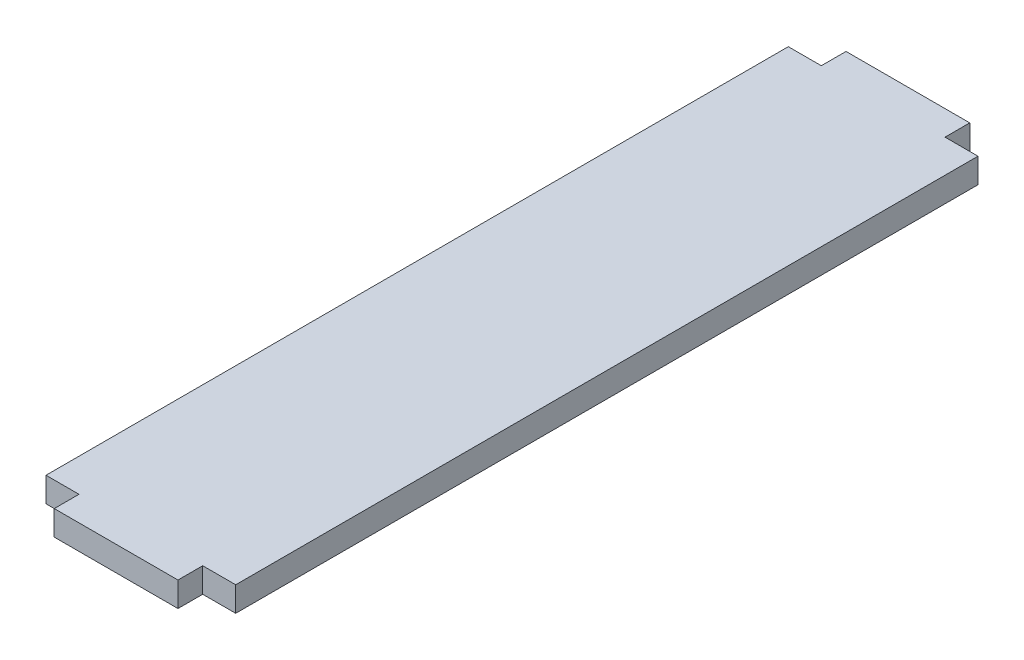
ISO-10303-21;
HEADER;
FILE_DESCRIPTION(('STEP AP214'),'2;1');
FILE_NAME('part.step','',(''),(''),'','','');
FILE_SCHEMA(('AUTOMOTIVE_DESIGN { 1 0 10303 214 1 1 1 1 }'));
ENDSEC;
DATA;
#1=APPLICATION_CONTEXT('core data for automotive mechanical design processes');
#2=APPLICATION_PROTOCOL_DEFINITION('international standard','automotive_design',2000,#1);
#3=PRODUCT_CONTEXT('',#1,'mechanical');
#4=PRODUCT('Part','Part','',(#3));
#5=PRODUCT_RELATED_PRODUCT_CATEGORY('part','',(#4));
#6=PRODUCT_DEFINITION_FORMATION('','',#4);
#7=PRODUCT_DEFINITION_CONTEXT('part definition',#1,'design');
#8=PRODUCT_DEFINITION('design','',#6,#7);
#9=PRODUCT_DEFINITION_SHAPE('','',#8);
#10=(LENGTH_UNIT() NAMED_UNIT(*) SI_UNIT(.MILLI.,.METRE.));
#11=(NAMED_UNIT(*) PLANE_ANGLE_UNIT() SI_UNIT($,.RADIAN.));
#12=(NAMED_UNIT(*) SI_UNIT($,.STERADIAN.) SOLID_ANGLE_UNIT());
#13=UNCERTAINTY_MEASURE_WITH_UNIT(LENGTH_MEASURE(1.E-05),#10,'distance_accuracy_value','');
#14=(GEOMETRIC_REPRESENTATION_CONTEXT(3) GLOBAL_UNCERTAINTY_ASSIGNED_CONTEXT((#13)) GLOBAL_UNIT_ASSIGNED_CONTEXT((#10,
#11,#12)) REPRESENTATION_CONTEXT('',''));
#15=CARTESIAN_POINT('',(0.,0.,0.));
#16=DIRECTION('',(0.,0.,1.));
#17=DIRECTION('',(1.,0.,0.));
#18=AXIS2_PLACEMENT_3D('',#15,#16,#17);
#19=CARTESIAN_POINT('',(5.75,1.5,22.5));
#20=DIRECTION('',(-1.,0.,0.));
#21=DIRECTION('',(0.,0.,1.));
#22=AXIS2_PLACEMENT_3D('',#19,#20,#21);
#23=PLANE('',#22);
#24=DIRECTION('',(0.,0.,-1.));
#25=VECTOR('',#24,1.);
#26=CARTESIAN_POINT('',(5.75,0.,22.5));
#27=LINE('',#26,#25);
#28=CARTESIAN_POINT('',(5.75,0.,22.5));
#29=VERTEX_POINT('',#28);
#30=CARTESIAN_POINT('',(5.75,0.,-22.5));
#31=VERTEX_POINT('',#30);
#32=EDGE_CURVE('E152',#29,#31,#27,.T.);
#33=ORIENTED_EDGE('',*,*,#32,.T.);
#34=DIRECTION('',(0.,-1.,0.));
#35=VECTOR('',#34,1.);
#36=CARTESIAN_POINT('',(5.75,1.5,-22.5));
#37=LINE('',#36,#35);
#38=CARTESIAN_POINT('',(5.75,1.5,-22.5));
#39=VERTEX_POINT('',#38);
#40=EDGE_CURVE('E11',#39,#31,#37,.T.);
#41=ORIENTED_EDGE('',*,*,#40,.F.);
#42=DIRECTION('',(0.,0.,-1.));
#43=VECTOR('',#42,1.);
#44=CARTESIAN_POINT('',(5.75,1.5,22.5));
#45=LINE('',#44,#43);
#46=CARTESIAN_POINT('',(5.75,1.5,22.5));
#47=VERTEX_POINT('',#46);
#48=EDGE_CURVE('E174',#47,#39,#45,.T.);
#49=ORIENTED_EDGE('',*,*,#48,.F.);
#50=DIRECTION('',(0.,-1.,0.));
#51=VECTOR('',#50,1.);
#52=CARTESIAN_POINT('',(5.75,1.5,22.5));
#53=LINE('',#52,#51);
#54=EDGE_CURVE('E148',#47,#29,#53,.T.);
#55=ORIENTED_EDGE('',*,*,#54,.T.);
#56=EDGE_LOOP('',(#33,#41,#49,#55));
#57=FACE_BOUND('',#56,.T.);
#58=ADVANCED_FACE('F32',(#57),#23,.F.);
#59=CARTESIAN_POINT('',(3.75,1.5,-22.5));
#60=DIRECTION('',(0.,0.,1.));
#61=DIRECTION('',(1.,0.,0.));
#62=AXIS2_PLACEMENT_3D('',#59,#60,#61);
#63=PLANE('',#62);
#64=DIRECTION('',(-1.,0.,0.));
#65=VECTOR('',#64,1.);
#66=CARTESIAN_POINT('',(3.75,0.,-22.5));
#67=LINE('',#66,#65);
#68=CARTESIAN_POINT('',(3.75,0.,-22.5));
#69=VERTEX_POINT('',#68);
#70=EDGE_CURVE('E155',#31,#69,#67,.T.);
#71=ORIENTED_EDGE('',*,*,#70,.T.);
#72=DIRECTION('',(0.,-1.,0.));
#73=VECTOR('',#72,1.);
#74=CARTESIAN_POINT('',(3.75,1.5,-22.5));
#75=LINE('',#74,#73);
#76=CARTESIAN_POINT('',(3.75,1.5,-22.5));
#77=VERTEX_POINT('',#76);
#78=EDGE_CURVE('E40',#77,#69,#75,.T.);
#79=ORIENTED_EDGE('',*,*,#78,.F.);
#80=DIRECTION('',(-1.,0.,0.));
#81=VECTOR('',#80,1.);
#82=CARTESIAN_POINT('',(3.75,1.5,-22.5));
#83=LINE('',#82,#81);
#84=EDGE_CURVE('E103',#39,#77,#83,.T.);
#85=ORIENTED_EDGE('',*,*,#84,.F.);
#86=ORIENTED_EDGE('',*,*,#40,.T.);
#87=EDGE_LOOP('',(#71,#79,#85,#86));
#88=FACE_BOUND('',#87,.T.);
#89=ADVANCED_FACE('F252',(#88),#63,.F.);
#90=CARTESIAN_POINT('',(3.75,1.5,-22.5));
#91=DIRECTION('',(-1.,0.,0.));
#92=DIRECTION('',(0.,0.,1.));
#93=AXIS2_PLACEMENT_3D('',#90,#91,#92);
#94=PLANE('',#93);
#95=DIRECTION('',(0.,0.,-1.));
#96=VECTOR('',#95,1.);
#97=CARTESIAN_POINT('',(3.75,0.,-22.5));
#98=LINE('',#97,#96);
#99=CARTESIAN_POINT('',(3.75,0.,-24.));
#100=VERTEX_POINT('',#99);
#101=EDGE_CURVE('E157',#69,#100,#98,.T.);
#102=ORIENTED_EDGE('',*,*,#101,.T.);
#103=DIRECTION('',(0.,-1.,0.));
#104=VECTOR('',#103,1.);
#105=CARTESIAN_POINT('',(3.75,1.5,-24.));
#106=LINE('',#105,#104);
#107=CARTESIAN_POINT('',(3.75,1.5,-24.));
#108=VERTEX_POINT('',#107);
#109=EDGE_CURVE('E193',#108,#100,#106,.T.);
#110=ORIENTED_EDGE('',*,*,#109,.F.);
#111=DIRECTION('',(0.,0.,-1.));
#112=VECTOR('',#111,1.);
#113=CARTESIAN_POINT('',(3.75,1.5,-22.5));
#114=LINE('',#113,#112);
#115=EDGE_CURVE('E201',#77,#108,#114,.T.);
#116=ORIENTED_EDGE('',*,*,#115,.F.);
#117=ORIENTED_EDGE('',*,*,#78,.T.);
#118=EDGE_LOOP('',(#102,#110,#116,#117));
#119=FACE_BOUND('',#118,.T.);
#120=ADVANCED_FACE('F199',(#119),#94,.F.);
#121=CARTESIAN_POINT('',(-3.75,1.5,-24.));
#122=DIRECTION('',(0.,0.,1.));
#123=DIRECTION('',(1.,0.,0.));
#124=AXIS2_PLACEMENT_3D('',#121,#122,#123);
#125=PLANE('',#124);
#126=DIRECTION('',(-1.,0.,0.));
#127=VECTOR('',#126,1.);
#128=CARTESIAN_POINT('',(-3.75,0.,-24.));
#129=LINE('',#128,#127);
#130=CARTESIAN_POINT('',(-3.75,0.,-24.));
#131=VERTEX_POINT('',#130);
#132=EDGE_CURVE('E159',#100,#131,#129,.T.);
#133=ORIENTED_EDGE('',*,*,#132,.T.);
#134=DIRECTION('',(0.,-1.,0.));
#135=VECTOR('',#134,1.);
#136=CARTESIAN_POINT('',(-3.75,1.5,-24.));
#137=LINE('',#136,#135);
#138=CARTESIAN_POINT('',(-3.75,1.5,-24.));
#139=VERTEX_POINT('',#138);
#140=EDGE_CURVE('E190',#139,#131,#137,.T.);
#141=ORIENTED_EDGE('',*,*,#140,.F.);
#142=DIRECTION('',(-1.,0.,0.));
#143=VECTOR('',#142,1.);
#144=CARTESIAN_POINT('',(-3.75,1.5,-24.));
#145=LINE('',#144,#143);
#146=EDGE_CURVE('E219',#108,#139,#145,.T.);
#147=ORIENTED_EDGE('',*,*,#146,.F.);
#148=ORIENTED_EDGE('',*,*,#109,.T.);
#149=EDGE_LOOP('',(#133,#141,#147,#148));
#150=FACE_BOUND('',#149,.T.);
#151=ADVANCED_FACE('F210',(#150),#125,.F.);
#152=CARTESIAN_POINT('',(-3.75,1.5,-22.5));
#153=DIRECTION('',(1.,0.,0.));
#154=DIRECTION('',(0.,0.,-1.));
#155=AXIS2_PLACEMENT_3D('',#152,#153,#154);
#156=PLANE('',#155);
#157=DIRECTION('',(0.,0.,1.));
#158=VECTOR('',#157,1.);
#159=CARTESIAN_POINT('',(-3.75,0.,-22.5));
#160=LINE('',#159,#158);
#161=CARTESIAN_POINT('',(-3.75,0.,-22.5));
#162=VERTEX_POINT('',#161);
#163=EDGE_CURVE('E161',#131,#162,#160,.T.);
#164=ORIENTED_EDGE('',*,*,#163,.T.);
#165=DIRECTION('',(0.,-1.,0.));
#166=VECTOR('',#165,1.);
#167=CARTESIAN_POINT('',(-3.75,1.5,-22.5));
#168=LINE('',#167,#166);
#169=CARTESIAN_POINT('',(-3.75,1.5,-22.5));
#170=VERTEX_POINT('',#169);
#171=EDGE_CURVE('E187',#170,#162,#168,.T.);
#172=ORIENTED_EDGE('',*,*,#171,.F.);
#173=DIRECTION('',(0.,0.,1.));
#174=VECTOR('',#173,1.);
#175=CARTESIAN_POINT('',(-3.75,1.5,-22.5));
#176=LINE('',#175,#174);
#177=EDGE_CURVE('E216',#139,#170,#176,.T.);
#178=ORIENTED_EDGE('',*,*,#177,.F.);
#179=ORIENTED_EDGE('',*,*,#140,.T.);
#180=EDGE_LOOP('',(#164,#172,#178,#179));
#181=FACE_BOUND('',#180,.T.);
#182=ADVANCED_FACE('F214',(#181),#156,.F.);
#183=CARTESIAN_POINT('',(-5.75,1.5,-22.5));
#184=DIRECTION('',(0.,0.,1.));
#185=DIRECTION('',(1.,0.,0.));
#186=AXIS2_PLACEMENT_3D('',#183,#184,#185);
#187=PLANE('',#186);
#188=DIRECTION('',(-1.,0.,0.));
#189=VECTOR('',#188,1.);
#190=CARTESIAN_POINT('',(-5.75,0.,-22.5));
#191=LINE('',#190,#189);
#192=CARTESIAN_POINT('',(-5.75,0.,-22.5));
#193=VERTEX_POINT('',#192);
#194=EDGE_CURVE('E163',#162,#193,#191,.T.);
#195=ORIENTED_EDGE('',*,*,#194,.T.);
#196=DIRECTION('',(0.,-1.,0.));
#197=VECTOR('',#196,1.);
#198=CARTESIAN_POINT('',(-5.75,1.5,-22.5));
#199=LINE('',#198,#197);
#200=CARTESIAN_POINT('',(-5.75,1.5,-22.5));
#201=VERTEX_POINT('',#200);
#202=EDGE_CURVE('E184',#201,#193,#199,.T.);
#203=ORIENTED_EDGE('',*,*,#202,.F.);
#204=DIRECTION('',(-1.,0.,0.));
#205=VECTOR('',#204,1.);
#206=CARTESIAN_POINT('',(-5.75,1.5,-22.5));
#207=LINE('',#206,#205);
#208=EDGE_CURVE('E218',#170,#201,#207,.T.);
#209=ORIENTED_EDGE('',*,*,#208,.F.);
#210=ORIENTED_EDGE('',*,*,#171,.T.);
#211=EDGE_LOOP('',(#195,#203,#209,#210));
#212=FACE_BOUND('',#211,.T.);
#213=ADVANCED_FACE('F265',(#212),#187,.F.);
#214=CARTESIAN_POINT('',(-5.75,1.5,22.5));
#215=DIRECTION('',(1.,0.,0.));
#216=DIRECTION('',(0.,0.,-1.));
#217=AXIS2_PLACEMENT_3D('',#214,#215,#216);
#218=PLANE('',#217);
#219=DIRECTION('',(0.,0.,1.));
#220=VECTOR('',#219,1.);
#221=CARTESIAN_POINT('',(-5.75,0.,22.5));
#222=LINE('',#221,#220);
#223=CARTESIAN_POINT('',(-5.75,0.,22.5));
#224=VERTEX_POINT('',#223);
#225=EDGE_CURVE('E165',#193,#224,#222,.T.);
#226=ORIENTED_EDGE('',*,*,#225,.T.);
#227=DIRECTION('',(0.,-1.,0.));
#228=VECTOR('',#227,1.);
#229=CARTESIAN_POINT('',(-5.75,1.5,22.5));
#230=LINE('',#229,#228);
#231=CARTESIAN_POINT('',(-5.75,1.5,22.5));
#232=VERTEX_POINT('',#231);
#233=EDGE_CURVE('E181',#232,#224,#230,.T.);
#234=ORIENTED_EDGE('',*,*,#233,.F.);
#235=DIRECTION('',(0.,0.,1.));
#236=VECTOR('',#235,1.);
#237=CARTESIAN_POINT('',(-5.75,1.5,22.5));
#238=LINE('',#237,#236);
#239=EDGE_CURVE('E221',#201,#232,#238,.T.);
#240=ORIENTED_EDGE('',*,*,#239,.F.);
#241=ORIENTED_EDGE('',*,*,#202,.T.);
#242=EDGE_LOOP('',(#226,#234,#240,#241));
#243=FACE_BOUND('',#242,.T.);
#244=ADVANCED_FACE('F268',(#243),#218,.F.);
#245=CARTESIAN_POINT('',(-5.75,1.5,22.5));
#246=DIRECTION('',(0.,0.,-1.));
#247=DIRECTION('',(-1.,0.,0.));
#248=AXIS2_PLACEMENT_3D('',#245,#246,#247);
#249=PLANE('',#248);
#250=DIRECTION('',(1.,0.,0.));
#251=VECTOR('',#250,1.);
#252=CARTESIAN_POINT('',(-5.75,0.,22.5));
#253=LINE('',#252,#251);
#254=CARTESIAN_POINT('',(-3.75,0.,22.5));
#255=VERTEX_POINT('',#254);
#256=EDGE_CURVE('E167',#224,#255,#253,.T.);
#257=ORIENTED_EDGE('',*,*,#256,.T.);
#258=DIRECTION('',(0.,-1.,0.));
#259=VECTOR('',#258,1.);
#260=CARTESIAN_POINT('',(-3.75,1.5,22.5));
#261=LINE('',#260,#259);
#262=CARTESIAN_POINT('',(-3.75,1.5,22.5));
#263=VERTEX_POINT('',#262);
#264=EDGE_CURVE('E178',#263,#255,#261,.T.);
#265=ORIENTED_EDGE('',*,*,#264,.F.);
#266=DIRECTION('',(1.,0.,0.));
#267=VECTOR('',#266,1.);
#268=CARTESIAN_POINT('',(-5.75,1.5,22.5));
#269=LINE('',#268,#267);
#270=EDGE_CURVE('E227',#232,#263,#269,.T.);
#271=ORIENTED_EDGE('',*,*,#270,.F.);
#272=ORIENTED_EDGE('',*,*,#233,.T.);
#273=EDGE_LOOP('',(#257,#265,#271,#272));
#274=FACE_BOUND('',#273,.T.);
#275=ADVANCED_FACE('F233',(#274),#249,.F.);
#276=CARTESIAN_POINT('',(-3.75,1.5,22.5));
#277=DIRECTION('',(1.,0.,0.));
#278=DIRECTION('',(0.,0.,-1.));
#279=AXIS2_PLACEMENT_3D('',#276,#277,#278);
#280=PLANE('',#279);
#281=DIRECTION('',(0.,0.,1.));
#282=VECTOR('',#281,1.);
#283=CARTESIAN_POINT('',(-3.75,0.,22.5));
#284=LINE('',#283,#282);
#285=CARTESIAN_POINT('',(-3.75,0.,24.));
#286=VERTEX_POINT('',#285);
#287=EDGE_CURVE('E169',#255,#286,#284,.T.);
#288=ORIENTED_EDGE('',*,*,#287,.T.);
#289=DIRECTION('',(0.,-1.,0.));
#290=VECTOR('',#289,1.);
#291=CARTESIAN_POINT('',(-3.75,1.5,24.));
#292=LINE('',#291,#290);
#293=CARTESIAN_POINT('',(-3.75,1.5,24.));
#294=VERTEX_POINT('',#293);
#295=EDGE_CURVE('E143',#294,#286,#292,.T.);
#296=ORIENTED_EDGE('',*,*,#295,.F.);
#297=DIRECTION('',(0.,0.,1.));
#298=VECTOR('',#297,1.);
#299=CARTESIAN_POINT('',(-3.75,1.5,22.5));
#300=LINE('',#299,#298);
#301=EDGE_CURVE('E134',#263,#294,#300,.T.);
#302=ORIENTED_EDGE('',*,*,#301,.F.);
#303=ORIENTED_EDGE('',*,*,#264,.T.);
#304=EDGE_LOOP('',(#288,#296,#302,#303));
#305=FACE_BOUND('',#304,.T.);
#306=ADVANCED_FACE('F237',(#305),#280,.F.);
#307=CARTESIAN_POINT('',(-3.75,1.5,24.));
#308=DIRECTION('',(0.,0.,-1.));
#309=DIRECTION('',(-1.,0.,0.));
#310=AXIS2_PLACEMENT_3D('',#307,#308,#309);
#311=PLANE('',#310);
#312=DIRECTION('',(1.,0.,0.));
#313=VECTOR('',#312,1.);
#314=CARTESIAN_POINT('',(-3.75,0.,24.));
#315=LINE('',#314,#313);
#316=CARTESIAN_POINT('',(3.75,0.,24.));
#317=VERTEX_POINT('',#316);
#318=EDGE_CURVE('E142',#286,#317,#315,.T.);
#319=ORIENTED_EDGE('',*,*,#318,.T.);
#320=DIRECTION('',(0.,-1.,0.));
#321=VECTOR('',#320,1.);
#322=CARTESIAN_POINT('',(3.75,1.5,24.));
#323=LINE('',#322,#321);
#324=CARTESIAN_POINT('',(3.75,1.5,24.));
#325=VERTEX_POINT('',#324);
#326=EDGE_CURVE('E139',#325,#317,#323,.T.);
#327=ORIENTED_EDGE('',*,*,#326,.F.);
#328=DIRECTION('',(1.,0.,0.));
#329=VECTOR('',#328,1.);
#330=CARTESIAN_POINT('',(-3.75,1.5,24.));
#331=LINE('',#330,#329);
#332=EDGE_CURVE('E128',#294,#325,#331,.T.);
#333=ORIENTED_EDGE('',*,*,#332,.F.);
#334=ORIENTED_EDGE('',*,*,#295,.T.);
#335=EDGE_LOOP('',(#319,#327,#333,#334));
#336=FACE_BOUND('',#335,.T.);
#337=ADVANCED_FACE('F140',(#336),#311,.F.);
#338=CARTESIAN_POINT('',(3.75,1.5,22.5));
#339=DIRECTION('',(-1.,0.,0.));
#340=DIRECTION('',(0.,0.,1.));
#341=AXIS2_PLACEMENT_3D('',#338,#339,#340);
#342=PLANE('',#341);
#343=DIRECTION('',(0.,0.,-1.));
#344=VECTOR('',#343,1.);
#345=CARTESIAN_POINT('',(3.75,0.,22.5));
#346=LINE('',#345,#344);
#347=CARTESIAN_POINT('',(3.75,0.,22.5));
#348=VERTEX_POINT('',#347);
#349=EDGE_CURVE('E89',#317,#348,#346,.T.);
#350=ORIENTED_EDGE('',*,*,#349,.T.);
#351=DIRECTION('',(0.,-1.,0.));
#352=VECTOR('',#351,1.);
#353=CARTESIAN_POINT('',(3.75,1.5,22.5));
#354=LINE('',#353,#352);
#355=CARTESIAN_POINT('',(3.75,1.5,22.5));
#356=VERTEX_POINT('',#355);
#357=EDGE_CURVE('E144',#356,#348,#354,.T.);
#358=ORIENTED_EDGE('',*,*,#357,.F.);
#359=DIRECTION('',(0.,0.,-1.));
#360=VECTOR('',#359,1.);
#361=CARTESIAN_POINT('',(3.75,1.5,22.5));
#362=LINE('',#361,#360);
#363=EDGE_CURVE('E132',#325,#356,#362,.T.);
#364=ORIENTED_EDGE('',*,*,#363,.F.);
#365=ORIENTED_EDGE('',*,*,#326,.T.);
#366=EDGE_LOOP('',(#350,#358,#364,#365));
#367=FACE_BOUND('',#366,.T.);
#368=ADVANCED_FACE('F146',(#367),#342,.F.);
#369=CARTESIAN_POINT('',(3.75,1.5,22.5));
#370=DIRECTION('',(0.,0.,-1.));
#371=DIRECTION('',(-1.,0.,0.));
#372=AXIS2_PLACEMENT_3D('',#369,#370,#371);
#373=PLANE('',#372);
#374=DIRECTION('',(1.,0.,0.));
#375=VECTOR('',#374,1.);
#376=CARTESIAN_POINT('',(3.75,0.,22.5));
#377=LINE('',#376,#375);
#378=EDGE_CURVE('E95',#348,#29,#377,.T.);
#379=ORIENTED_EDGE('',*,*,#378,.T.);
#380=ORIENTED_EDGE('',*,*,#54,.F.);
#381=DIRECTION('',(1.,0.,0.));
#382=VECTOR('',#381,1.);
#383=CARTESIAN_POINT('',(3.75,1.5,22.5));
#384=LINE('',#383,#382);
#385=EDGE_CURVE('E48',#356,#47,#384,.T.);
#386=ORIENTED_EDGE('',*,*,#385,.F.);
#387=ORIENTED_EDGE('',*,*,#357,.T.);
#388=EDGE_LOOP('',(#379,#380,#386,#387));
#389=FACE_BOUND('',#388,.T.);
#390=ADVANCED_FACE('F241',(#389),#373,.F.);
#391=CARTESIAN_POINT('',(0.,1.5,0.));
#392=DIRECTION('',(0.,-1.,0.));
#393=DIRECTION('',(0.,0.,-1.));
#394=AXIS2_PLACEMENT_3D('',#391,#392,#393);
#395=PLANE('',#394);
#396=ORIENTED_EDGE('',*,*,#48,.T.);
#397=ORIENTED_EDGE('',*,*,#84,.T.);
#398=ORIENTED_EDGE('',*,*,#115,.T.);
#399=ORIENTED_EDGE('',*,*,#146,.T.);
#400=ORIENTED_EDGE('',*,*,#177,.T.);
#401=ORIENTED_EDGE('',*,*,#208,.T.);
#402=ORIENTED_EDGE('',*,*,#239,.T.);
#403=ORIENTED_EDGE('',*,*,#270,.T.);
#404=ORIENTED_EDGE('',*,*,#301,.T.);
#405=ORIENTED_EDGE('',*,*,#332,.T.);
#406=ORIENTED_EDGE('',*,*,#363,.T.);
#407=ORIENTED_EDGE('',*,*,#385,.T.);
#408=EDGE_LOOP('',(#396,#397,#398,#399,#400,#401,#402,#403,#404,#405,#406,#407));
#409=FACE_BOUND('',#408,.T.);
#410=ADVANCED_FACE('F130',(#409),#395,.F.);
#411=CARTESIAN_POINT('',(0.,0.,0.));
#412=DIRECTION('',(0.,-1.,0.));
#413=DIRECTION('',(0.,0.,-1.));
#414=AXIS2_PLACEMENT_3D('',#411,#412,#413);
#415=PLANE('',#414);
#416=ORIENTED_EDGE('',*,*,#32,.F.);
#417=ORIENTED_EDGE('',*,*,#378,.F.);
#418=ORIENTED_EDGE('',*,*,#349,.F.);
#419=ORIENTED_EDGE('',*,*,#318,.F.);
#420=ORIENTED_EDGE('',*,*,#287,.F.);
#421=ORIENTED_EDGE('',*,*,#256,.F.);
#422=ORIENTED_EDGE('',*,*,#225,.F.);
#423=ORIENTED_EDGE('',*,*,#194,.F.);
#424=ORIENTED_EDGE('',*,*,#163,.F.);
#425=ORIENTED_EDGE('',*,*,#132,.F.);
#426=ORIENTED_EDGE('',*,*,#101,.F.);
#427=ORIENTED_EDGE('',*,*,#70,.F.);
#428=EDGE_LOOP('',(#416,#417,#418,#419,#420,#421,#422,#423,#424,#425,#426,#427));
#429=FACE_BOUND('',#428,.T.);
#430=ADVANCED_FACE('F205',(#429),#415,.T.);
#431=CLOSED_SHELL('',(#58,#89,#120,#151,#182,#213,#244,#275,#306,#337,#368,#390,#410,#430));
#432=MANIFOLD_SOLID_BREP('B2',#431);
#433=ADVANCED_BREP_SHAPE_REPRESENTATION('',(#18,#432),#14);
#434=SHAPE_DEFINITION_REPRESENTATION(#9,#433);
ENDSEC;
END-ISO-10303-21;
